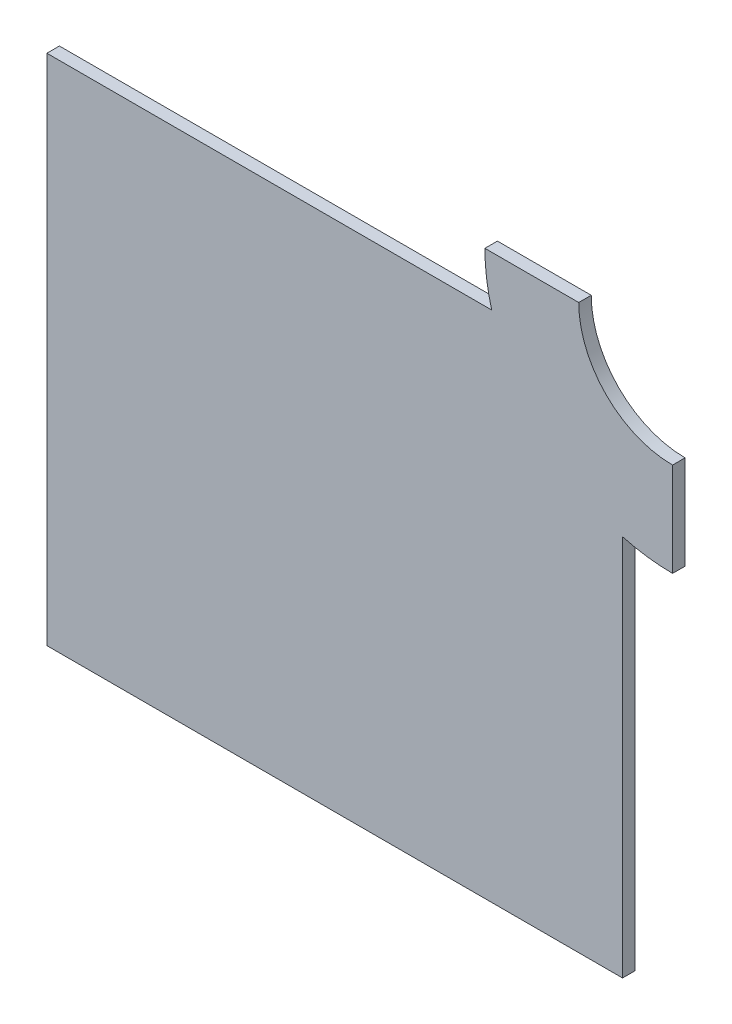
ISO-10303-21;
HEADER;
FILE_DESCRIPTION(('STEP AP214'),'2;1');
FILE_NAME('part.step','',(''),(''),'','','');
FILE_SCHEMA(('AUTOMOTIVE_DESIGN { 1 0 10303 214 1 1 1 1 }'));
ENDSEC;
DATA;
#1=APPLICATION_CONTEXT('core data for automotive mechanical design processes');
#2=APPLICATION_PROTOCOL_DEFINITION('international standard','automotive_design',2000,#1);
#3=PRODUCT_CONTEXT('',#1,'mechanical');
#4=PRODUCT('Part','Part','',(#3));
#5=PRODUCT_RELATED_PRODUCT_CATEGORY('part','',(#4));
#6=PRODUCT_DEFINITION_FORMATION('','',#4);
#7=PRODUCT_DEFINITION_CONTEXT('part definition',#1,'design');
#8=PRODUCT_DEFINITION('design','',#6,#7);
#9=PRODUCT_DEFINITION_SHAPE('','',#8);
#10=(LENGTH_UNIT() NAMED_UNIT(*) SI_UNIT(.MILLI.,.METRE.));
#11=(NAMED_UNIT(*) PLANE_ANGLE_UNIT() SI_UNIT($,.RADIAN.));
#12=(NAMED_UNIT(*) SI_UNIT($,.STERADIAN.) SOLID_ANGLE_UNIT());
#13=UNCERTAINTY_MEASURE_WITH_UNIT(LENGTH_MEASURE(1.E-05),#10,'distance_accuracy_value','');
#14=(GEOMETRIC_REPRESENTATION_CONTEXT(3) GLOBAL_UNCERTAINTY_ASSIGNED_CONTEXT((#13)) GLOBAL_UNIT_ASSIGNED_CONTEXT((#10,
#11,#12)) REPRESENTATION_CONTEXT('',''));
#15=CARTESIAN_POINT('',(0.,0.,0.));
#16=DIRECTION('',(0.,0.,1.));
#17=DIRECTION('',(1.,0.,0.));
#18=AXIS2_PLACEMENT_3D('',#15,#16,#17);
#19=CARTESIAN_POINT('',(1.6,1.25,0.));
#20=DIRECTION('',(0.,0.,-1.));
#21=DIRECTION('',(-1.,0.,0.));
#22=AXIS2_PLACEMENT_3D('',#19,#20,#21);
#23=PLANE('',#22);
#24=CARTESIAN_POINT('',(1.6,1.25,0.));
#25=DIRECTION('',(0.,0.,1.));
#26=DIRECTION('',(1.,0.,0.));
#27=AXIS2_PLACEMENT_3D('',#24,#25,#26);
#28=CIRCLE('',#27,0.3);
#29=CARTESIAN_POINT('',(1.31086335410398,1.17,0.));
#30=VERTEX_POINT('',#29);
#31=CARTESIAN_POINT('',(1.3,1.25,0.));
#32=VERTEX_POINT('',#31);
#33=EDGE_CURVE('E151',#30,#32,#28,.F.);
#34=ORIENTED_EDGE('',*,*,#33,.F.);
#35=DIRECTION('',(1.,0.,0.));
#36=VECTOR('',#35,1.);
#37=CARTESIAN_POINT('',(0.6,1.17,0.));
#38=LINE('',#37,#36);
#39=CARTESIAN_POINT('',(0.6,1.17,0.));
#40=VERTEX_POINT('',#39);
#41=EDGE_CURVE('E108',#30,#40,#38,.F.);
#42=ORIENTED_EDGE('',*,*,#41,.T.);
#43=DIRECTION('',(0.,1.,0.));
#44=VECTOR('',#43,1.);
#45=CARTESIAN_POINT('',(0.6,0.35,0.));
#46=LINE('',#45,#44);
#47=CARTESIAN_POINT('',(0.6,0.35,0.));
#48=VERTEX_POINT('',#47);
#49=EDGE_CURVE('E87',#40,#48,#46,.F.);
#50=ORIENTED_EDGE('',*,*,#49,.T.);
#51=DIRECTION('',(1.,0.,0.));
#52=VECTOR('',#51,1.);
#53=CARTESIAN_POINT('',(1.52,0.35,0.));
#54=LINE('',#53,#52);
#55=CARTESIAN_POINT('',(1.52,0.35,0.));
#56=VERTEX_POINT('',#55);
#57=EDGE_CURVE('E84',#48,#56,#54,.T.);
#58=ORIENTED_EDGE('',*,*,#57,.T.);
#59=DIRECTION('',(0.,1.,0.));
#60=VECTOR('',#59,1.);
#61=CARTESIAN_POINT('',(1.52,0.960863354104,0.));
#62=LINE('',#61,#60);
#63=CARTESIAN_POINT('',(1.52,0.96086335410399,0.));
#64=VERTEX_POINT('',#63);
#65=EDGE_CURVE('E79',#56,#64,#62,.T.);
#66=ORIENTED_EDGE('',*,*,#65,.T.);
#67=CARTESIAN_POINT('',(1.6,1.25,0.));
#68=DIRECTION('',(0.,0.,1.));
#69=DIRECTION('',(1.,0.,0.));
#70=AXIS2_PLACEMENT_3D('',#67,#68,#69);
#71=CIRCLE('',#70,0.3);
#72=CARTESIAN_POINT('',(1.6,0.95,0.));
#73=VERTEX_POINT('',#72);
#74=EDGE_CURVE('E20',#73,#64,#71,.F.);
#75=ORIENTED_EDGE('',*,*,#74,.F.);
#76=DIRECTION('',(0.,1.,0.));
#77=VECTOR('',#76,1.);
#78=CARTESIAN_POINT('',(1.6,1.1,0.));
#79=LINE('',#78,#77);
#80=CARTESIAN_POINT('',(1.6,1.1,0.));
#81=VERTEX_POINT('',#80);
#82=EDGE_CURVE('E73',#73,#81,#79,.T.);
#83=ORIENTED_EDGE('',*,*,#82,.T.);
#84=CARTESIAN_POINT('',(1.6,1.25,0.));
#85=DIRECTION('',(0.,0.,1.));
#86=DIRECTION('',(1.,0.,0.));
#87=AXIS2_PLACEMENT_3D('',#84,#85,#86);
#88=CIRCLE('',#87,0.15);
#89=CARTESIAN_POINT('',(1.45,1.25,0.));
#90=VERTEX_POINT('',#89);
#91=EDGE_CURVE('E169',#81,#90,#88,.F.);
#92=ORIENTED_EDGE('',*,*,#91,.T.);
#93=DIRECTION('',(1.,0.,0.));
#94=VECTOR('',#93,1.);
#95=CARTESIAN_POINT('',(1.3,1.25,0.));
#96=LINE('',#95,#94);
#97=EDGE_CURVE('E148',#90,#32,#96,.F.);
#98=ORIENTED_EDGE('',*,*,#97,.T.);
#99=EDGE_LOOP('',(#34,#42,#50,#58,#66,#75,#83,#92,#98));
#100=FACE_BOUND('',#99,.T.);
#101=ADVANCED_FACE('F17',(#100),#23,.F.);
#102=CARTESIAN_POINT('',(1.6,1.1,-0.02));
#103=DIRECTION('',(-1.,0.,0.));
#104=DIRECTION('',(0.,0.,1.));
#105=AXIS2_PLACEMENT_3D('',#102,#103,#104);
#106=PLANE('',#105);
#107=DIRECTION('',(0.,1.,0.));
#108=VECTOR('',#107,1.);
#109=CARTESIAN_POINT('',(1.6,1.25,-0.02));
#110=LINE('',#109,#108);
#111=CARTESIAN_POINT('',(1.6,1.1,-0.02));
#112=VERTEX_POINT('',#111);
#113=CARTESIAN_POINT('',(1.6,0.95,-0.02));
#114=VERTEX_POINT('',#113);
#115=EDGE_CURVE('E168',#112,#114,#110,.F.);
#116=ORIENTED_EDGE('',*,*,#115,.F.);
#117=DIRECTION('',(0.,0.,1.));
#118=VECTOR('',#117,1.);
#119=CARTESIAN_POINT('',(1.6,1.1,-0.02));
#120=LINE('',#119,#118);
#121=EDGE_CURVE('E177',#112,#81,#120,.T.);
#122=ORIENTED_EDGE('',*,*,#121,.T.);
#123=ORIENTED_EDGE('',*,*,#82,.F.);
#124=DIRECTION('',(0.,0.,1.));
#125=VECTOR('',#124,1.);
#126=CARTESIAN_POINT('',(1.6,0.95,-0.02));
#127=LINE('',#126,#125);
#128=EDGE_CURVE('E144',#114,#73,#127,.T.);
#129=ORIENTED_EDGE('',*,*,#128,.F.);
#130=EDGE_LOOP('',(#116,#122,#123,#129));
#131=FACE_BOUND('',#130,.T.);
#132=ADVANCED_FACE('F210',(#131),#106,.F.);
#133=CARTESIAN_POINT('',(1.6,1.25,-0.02));
#134=DIRECTION('',(0.,0.,1.));
#135=DIRECTION('',(1.,0.,0.));
#136=AXIS2_PLACEMENT_3D('',#133,#134,#135);
#137=CYLINDRICAL_SURFACE('',#136,0.3);
#138=ORIENTED_EDGE('',*,*,#128,.T.);
#139=ORIENTED_EDGE('',*,*,#74,.T.);
#140=DIRECTION('',(0.,0.,1.));
#141=VECTOR('',#140,1.);
#142=CARTESIAN_POINT('',(1.52,0.960863354104,-0.02));
#143=LINE('',#142,#141);
#144=CARTESIAN_POINT('',(1.52,0.96086335410399,-0.02));
#145=VERTEX_POINT('',#144);
#146=EDGE_CURVE('E142',#64,#145,#143,.F.);
#147=ORIENTED_EDGE('',*,*,#146,.T.);
#148=CARTESIAN_POINT('',(1.6,1.25,-0.02));
#149=DIRECTION('',(0.,0.,1.));
#150=DIRECTION('',(1.,0.,0.));
#151=AXIS2_PLACEMENT_3D('',#148,#149,#150);
#152=CIRCLE('',#151,0.3);
#153=EDGE_CURVE('E165',#114,#145,#152,.F.);
#154=ORIENTED_EDGE('',*,*,#153,.F.);
#155=EDGE_LOOP('',(#138,#139,#147,#154));
#156=FACE_BOUND('',#155,.T.);
#157=ADVANCED_FACE('F214',(#156),#137,.T.);
#158=CARTESIAN_POINT('',(1.52,0.960863354104,-0.02));
#159=DIRECTION('',(-1.,0.,0.));
#160=DIRECTION('',(0.,0.,1.));
#161=AXIS2_PLACEMENT_3D('',#158,#159,#160);
#162=PLANE('',#161);
#163=DIRECTION('',(0.,1.,0.));
#164=VECTOR('',#163,1.);
#165=CARTESIAN_POINT('',(1.52,1.25,-0.02));
#166=LINE('',#165,#164);
#167=CARTESIAN_POINT('',(1.52,0.35,-0.02));
#168=VERTEX_POINT('',#167);
#169=EDGE_CURVE('E125',#145,#168,#166,.F.);
#170=ORIENTED_EDGE('',*,*,#169,.F.);
#171=ORIENTED_EDGE('',*,*,#146,.F.);
#172=ORIENTED_EDGE('',*,*,#65,.F.);
#173=DIRECTION('',(0.,0.,1.));
#174=VECTOR('',#173,1.);
#175=CARTESIAN_POINT('',(1.52,0.35,-0.02));
#176=LINE('',#175,#174);
#177=EDGE_CURVE('E138',#56,#168,#176,.F.);
#178=ORIENTED_EDGE('',*,*,#177,.T.);
#179=EDGE_LOOP('',(#170,#171,#172,#178));
#180=FACE_BOUND('',#179,.T.);
#181=ADVANCED_FACE('F217',(#180),#162,.F.);
#182=CARTESIAN_POINT('',(1.52,0.35,-0.02));
#183=DIRECTION('',(0.,1.,0.));
#184=DIRECTION('',(0.,0.,1.));
#185=AXIS2_PLACEMENT_3D('',#182,#183,#184);
#186=PLANE('',#185);
#187=DIRECTION('',(-1.,0.,0.));
#188=VECTOR('',#187,1.);
#189=CARTESIAN_POINT('',(1.6,0.35,-0.02));
#190=LINE('',#189,#188);
#191=CARTESIAN_POINT('',(0.6,0.35,-0.02));
#192=VERTEX_POINT('',#191);
#193=EDGE_CURVE('E123',#168,#192,#190,.T.);
#194=ORIENTED_EDGE('',*,*,#193,.F.);
#195=ORIENTED_EDGE('',*,*,#177,.F.);
#196=ORIENTED_EDGE('',*,*,#57,.F.);
#197=DIRECTION('',(0.,0.,-1.));
#198=VECTOR('',#197,1.);
#199=CARTESIAN_POINT('',(0.6,0.35,-0.02));
#200=LINE('',#199,#198);
#201=EDGE_CURVE('E132',#48,#192,#200,.T.);
#202=ORIENTED_EDGE('',*,*,#201,.T.);
#203=EDGE_LOOP('',(#194,#195,#196,#202));
#204=FACE_BOUND('',#203,.T.);
#205=ADVANCED_FACE('F220',(#204),#186,.F.);
#206=CARTESIAN_POINT('',(0.6,0.35,-0.02));
#207=DIRECTION('',(1.,0.,0.));
#208=DIRECTION('',(0.,0.,-1.));
#209=AXIS2_PLACEMENT_3D('',#206,#207,#208);
#210=PLANE('',#209);
#211=DIRECTION('',(0.,1.,0.));
#212=VECTOR('',#211,1.);
#213=CARTESIAN_POINT('',(0.6,1.25,-0.02));
#214=LINE('',#213,#212);
#215=CARTESIAN_POINT('',(0.6,1.17,-0.02));
#216=VERTEX_POINT('',#215);
#217=EDGE_CURVE('E104',#192,#216,#214,.T.);
#218=ORIENTED_EDGE('',*,*,#217,.F.);
#219=ORIENTED_EDGE('',*,*,#201,.F.);
#220=ORIENTED_EDGE('',*,*,#49,.F.);
#221=DIRECTION('',(0.,0.,-1.));
#222=VECTOR('',#221,1.);
#223=CARTESIAN_POINT('',(0.6,1.17,-0.02));
#224=LINE('',#223,#222);
#225=EDGE_CURVE('E99',#40,#216,#224,.T.);
#226=ORIENTED_EDGE('',*,*,#225,.T.);
#227=EDGE_LOOP('',(#218,#219,#220,#226));
#228=FACE_BOUND('',#227,.T.);
#229=ADVANCED_FACE('F101',(#228),#210,.F.);
#230=CARTESIAN_POINT('',(0.6,1.17,-0.02));
#231=DIRECTION('',(0.,-1.,0.));
#232=DIRECTION('',(0.,0.,-1.));
#233=AXIS2_PLACEMENT_3D('',#230,#231,#232);
#234=PLANE('',#233);
#235=DIRECTION('',(-1.,0.,0.));
#236=VECTOR('',#235,1.);
#237=CARTESIAN_POINT('',(1.6,1.17,-0.02));
#238=LINE('',#237,#236);
#239=CARTESIAN_POINT('',(1.31086335410398,1.17,-0.02));
#240=VERTEX_POINT('',#239);
#241=EDGE_CURVE('E111',#216,#240,#238,.F.);
#242=ORIENTED_EDGE('',*,*,#241,.F.);
#243=ORIENTED_EDGE('',*,*,#225,.F.);
#244=ORIENTED_EDGE('',*,*,#41,.F.);
#245=DIRECTION('',(0.,0.,1.));
#246=VECTOR('',#245,1.);
#247=CARTESIAN_POINT('',(1.31086335410398,1.17,-0.02));
#248=LINE('',#247,#246);
#249=EDGE_CURVE('E107',#240,#30,#248,.T.);
#250=ORIENTED_EDGE('',*,*,#249,.F.);
#251=EDGE_LOOP('',(#242,#243,#244,#250));
#252=FACE_BOUND('',#251,.T.);
#253=ADVANCED_FACE('F112',(#252),#234,.F.);
#254=CARTESIAN_POINT('',(1.6,1.25,-0.02));
#255=DIRECTION('',(0.,0.,1.));
#256=DIRECTION('',(1.,0.,0.));
#257=AXIS2_PLACEMENT_3D('',#254,#255,#256);
#258=CYLINDRICAL_SURFACE('',#257,0.3);
#259=ORIENTED_EDGE('',*,*,#249,.T.);
#260=ORIENTED_EDGE('',*,*,#33,.T.);
#261=DIRECTION('',(0.,0.,-1.));
#262=VECTOR('',#261,1.);
#263=CARTESIAN_POINT('',(1.3,1.25,-0.02));
#264=LINE('',#263,#262);
#265=CARTESIAN_POINT('',(1.3,1.25,-0.02));
#266=VERTEX_POINT('',#265);
#267=EDGE_CURVE('E150',#32,#266,#264,.T.);
#268=ORIENTED_EDGE('',*,*,#267,.T.);
#269=CARTESIAN_POINT('',(1.6,1.25,-0.02));
#270=DIRECTION('',(0.,0.,1.));
#271=DIRECTION('',(1.,0.,0.));
#272=AXIS2_PLACEMENT_3D('',#269,#270,#271);
#273=CIRCLE('',#272,0.3);
#274=EDGE_CURVE('E117',#240,#266,#273,.F.);
#275=ORIENTED_EDGE('',*,*,#274,.F.);
#276=EDGE_LOOP('',(#259,#260,#268,#275));
#277=FACE_BOUND('',#276,.T.);
#278=ADVANCED_FACE('F188',(#277),#258,.T.);
#279=CARTESIAN_POINT('',(1.3,1.25,-0.02));
#280=DIRECTION('',(0.,-1.,0.));
#281=DIRECTION('',(0.,0.,-1.));
#282=AXIS2_PLACEMENT_3D('',#279,#280,#281);
#283=PLANE('',#282);
#284=DIRECTION('',(-1.,0.,0.));
#285=VECTOR('',#284,1.);
#286=CARTESIAN_POINT('',(1.6,1.25,-0.02));
#287=LINE('',#286,#285);
#288=CARTESIAN_POINT('',(1.45,1.25,-0.02));
#289=VERTEX_POINT('',#288);
#290=EDGE_CURVE('E26',#266,#289,#287,.F.);
#291=ORIENTED_EDGE('',*,*,#290,.F.);
#292=ORIENTED_EDGE('',*,*,#267,.F.);
#293=ORIENTED_EDGE('',*,*,#97,.F.);
#294=DIRECTION('',(0.,0.,1.));
#295=VECTOR('',#294,1.);
#296=CARTESIAN_POINT('',(1.45,1.25,-0.02));
#297=LINE('',#296,#295);
#298=EDGE_CURVE('E35',#90,#289,#297,.F.);
#299=ORIENTED_EDGE('',*,*,#298,.T.);
#300=EDGE_LOOP('',(#291,#292,#293,#299));
#301=FACE_BOUND('',#300,.T.);
#302=ADVANCED_FACE('F187',(#301),#283,.F.);
#303=CARTESIAN_POINT('',(1.6,1.25,-0.02));
#304=DIRECTION('',(0.,0.,1.));
#305=DIRECTION('',(1.,0.,0.));
#306=AXIS2_PLACEMENT_3D('',#303,#304,#305);
#307=CYLINDRICAL_SURFACE('',#306,0.15);
#308=CARTESIAN_POINT('',(1.6,1.25,-0.02));
#309=DIRECTION('',(0.,0.,1.));
#310=DIRECTION('',(1.,0.,0.));
#311=AXIS2_PLACEMENT_3D('',#308,#309,#310);
#312=CIRCLE('',#311,0.15);
#313=EDGE_CURVE('E11',#289,#112,#312,.T.);
#314=ORIENTED_EDGE('',*,*,#313,.F.);
#315=ORIENTED_EDGE('',*,*,#298,.F.);
#316=ORIENTED_EDGE('',*,*,#91,.F.);
#317=ORIENTED_EDGE('',*,*,#121,.F.);
#318=EDGE_LOOP('',(#314,#315,#316,#317));
#319=FACE_BOUND('',#318,.T.);
#320=ADVANCED_FACE('F196',(#319),#307,.F.);
#321=CARTESIAN_POINT('',(1.6,1.25,-0.02));
#322=DIRECTION('',(0.,0.,-1.));
#323=DIRECTION('',(-1.,0.,0.));
#324=AXIS2_PLACEMENT_3D('',#321,#322,#323);
#325=PLANE('',#324);
#326=ORIENTED_EDGE('',*,*,#290,.T.);
#327=ORIENTED_EDGE('',*,*,#313,.T.);
#328=ORIENTED_EDGE('',*,*,#115,.T.);
#329=ORIENTED_EDGE('',*,*,#153,.T.);
#330=ORIENTED_EDGE('',*,*,#169,.T.);
#331=ORIENTED_EDGE('',*,*,#193,.T.);
#332=ORIENTED_EDGE('',*,*,#217,.T.);
#333=ORIENTED_EDGE('',*,*,#241,.T.);
#334=ORIENTED_EDGE('',*,*,#274,.T.);
#335=EDGE_LOOP('',(#326,#327,#328,#329,#330,#331,#332,#333,#334));
#336=FACE_BOUND('',#335,.T.);
#337=ADVANCED_FACE('F120',(#336),#325,.T.);
#338=CLOSED_SHELL('',(#101,#132,#157,#181,#205,#229,#253,#278,#302,#320,#337));
#339=MANIFOLD_SOLID_BREP('B1',#338);
#340=ADVANCED_BREP_SHAPE_REPRESENTATION('',(#18,#339),#14);
#341=SHAPE_DEFINITION_REPRESENTATION(#9,#340);
ENDSEC;
END-ISO-10303-21;
